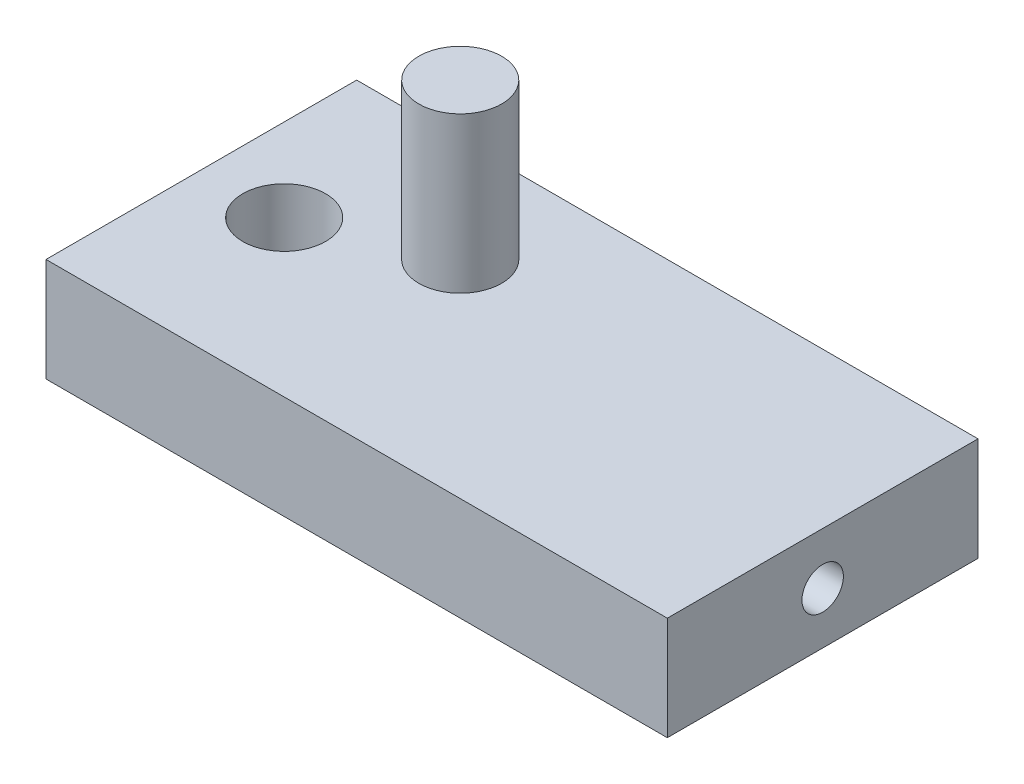
ISO-10303-21;
HEADER;
FILE_DESCRIPTION(('STEP AP214'),'2;1');
FILE_NAME('part.step','',(''),(''),'','','');
FILE_SCHEMA(('AUTOMOTIVE_DESIGN { 1 0 10303 214 1 1 1 1 }'));
ENDSEC;
DATA;
#1=APPLICATION_CONTEXT('core data for automotive mechanical design processes');
#2=APPLICATION_PROTOCOL_DEFINITION('international standard','automotive_design',2000,#1);
#3=PRODUCT_CONTEXT('',#1,'mechanical');
#4=PRODUCT('Part','Part','',(#3));
#5=PRODUCT_RELATED_PRODUCT_CATEGORY('part','',(#4));
#6=PRODUCT_DEFINITION_FORMATION('','',#4);
#7=PRODUCT_DEFINITION_CONTEXT('part definition',#1,'design');
#8=PRODUCT_DEFINITION('design','',#6,#7);
#9=PRODUCT_DEFINITION_SHAPE('','',#8);
#10=(LENGTH_UNIT() NAMED_UNIT(*) SI_UNIT(.MILLI.,.METRE.));
#11=(NAMED_UNIT(*) PLANE_ANGLE_UNIT() SI_UNIT($,.RADIAN.));
#12=(NAMED_UNIT(*) SI_UNIT($,.STERADIAN.) SOLID_ANGLE_UNIT());
#13=UNCERTAINTY_MEASURE_WITH_UNIT(LENGTH_MEASURE(1.E-05),#10,'distance_accuracy_value','');
#14=(GEOMETRIC_REPRESENTATION_CONTEXT(3) GLOBAL_UNCERTAINTY_ASSIGNED_CONTEXT((#13)) GLOBAL_UNIT_ASSIGNED_CONTEXT((#10,
#11,#12)) REPRESENTATION_CONTEXT('',''));
#15=CARTESIAN_POINT('',(0.,0.,0.));
#16=DIRECTION('',(0.,0.,1.));
#17=DIRECTION('',(1.,0.,0.));
#18=AXIS2_PLACEMENT_3D('',#15,#16,#17);
#19=CARTESIAN_POINT('',(15.,2.5,0.));
#20=DIRECTION('',(1.,0.,0.));
#21=DIRECTION('',(0.,0.,-1.));
#22=AXIS2_PLACEMENT_3D('',#19,#20,#21);
#23=PLANE('',#22);
#24=CARTESIAN_POINT('',(15.,0.,0.));
#25=DIRECTION('',(1.,0.,0.));
#26=DIRECTION('',(0.,0.,-1.));
#27=AXIS2_PLACEMENT_3D('',#24,#25,#26);
#28=CIRCLE('',#27,1.);
#29=CARTESIAN_POINT('',(15.,0.,-1.));
#30=VERTEX_POINT('',#29);
#31=EDGE_CURVE('E156',#30,#30,#28,.T.);
#32=ORIENTED_EDGE('',*,*,#31,.F.);
#33=EDGE_LOOP('',(#32));
#34=FACE_BOUND('',#33,.T.);
#35=DIRECTION('',(0.,0.,1.));
#36=VECTOR('',#35,1.);
#37=CARTESIAN_POINT('',(15.,-2.5,0.));
#38=LINE('',#37,#36);
#39=CARTESIAN_POINT('',(15.,-2.5,-7.5));
#40=VERTEX_POINT('',#39);
#41=CARTESIAN_POINT('',(15.,-2.5,7.5));
#42=VERTEX_POINT('',#41);
#43=EDGE_CURVE('E106',#40,#42,#38,.T.);
#44=ORIENTED_EDGE('',*,*,#43,.F.);
#45=DIRECTION('',(0.,-1.,0.));
#46=VECTOR('',#45,1.);
#47=CARTESIAN_POINT('',(15.,2.5,-7.5));
#48=LINE('',#47,#46);
#49=CARTESIAN_POINT('',(15.,2.5,-7.5));
#50=VERTEX_POINT('',#49);
#51=EDGE_CURVE('E11',#50,#40,#48,.T.);
#52=ORIENTED_EDGE('',*,*,#51,.F.);
#53=DIRECTION('',(0.,0.,1.));
#54=VECTOR('',#53,1.);
#55=CARTESIAN_POINT('',(15.,2.5,0.));
#56=LINE('',#55,#54);
#57=CARTESIAN_POINT('',(15.,2.5,7.5));
#58=VERTEX_POINT('',#57);
#59=EDGE_CURVE('E96',#50,#58,#56,.T.);
#60=ORIENTED_EDGE('',*,*,#59,.T.);
#61=DIRECTION('',(0.,-1.,0.));
#62=VECTOR('',#61,1.);
#63=CARTESIAN_POINT('',(15.,2.5,7.5));
#64=LINE('',#63,#62);
#65=EDGE_CURVE('E75',#58,#42,#64,.T.);
#66=ORIENTED_EDGE('',*,*,#65,.T.);
#67=EDGE_LOOP('',(#44,#52,#60,#66));
#68=FACE_BOUND('',#67,.T.);
#69=ADVANCED_FACE('F35',(#34,#68),#23,.T.);
#70=CARTESIAN_POINT('',(0.,2.5,-7.5));
#71=DIRECTION('',(0.,0.,-1.));
#72=DIRECTION('',(-1.,0.,0.));
#73=AXIS2_PLACEMENT_3D('',#70,#71,#72);
#74=PLANE('',#73);
#75=DIRECTION('',(1.,0.,0.));
#76=VECTOR('',#75,1.);
#77=CARTESIAN_POINT('',(0.,-2.5,-7.5));
#78=LINE('',#77,#76);
#79=CARTESIAN_POINT('',(-15.,-2.5,-7.5));
#80=VERTEX_POINT('',#79);
#81=EDGE_CURVE('E87',#80,#40,#78,.T.);
#82=ORIENTED_EDGE('',*,*,#81,.F.);
#83=DIRECTION('',(0.,-1.,0.));
#84=VECTOR('',#83,1.);
#85=CARTESIAN_POINT('',(-15.,2.5,-7.5));
#86=LINE('',#85,#84);
#87=CARTESIAN_POINT('',(-15.,2.5,-7.5));
#88=VERTEX_POINT('',#87);
#89=EDGE_CURVE('E44',#88,#80,#86,.T.);
#90=ORIENTED_EDGE('',*,*,#89,.F.);
#91=DIRECTION('',(1.,0.,0.));
#92=VECTOR('',#91,1.);
#93=CARTESIAN_POINT('',(0.,2.5,-7.5));
#94=LINE('',#93,#92);
#95=EDGE_CURVE('E85',#88,#50,#94,.T.);
#96=ORIENTED_EDGE('',*,*,#95,.T.);
#97=ORIENTED_EDGE('',*,*,#51,.T.);
#98=EDGE_LOOP('',(#82,#90,#96,#97));
#99=FACE_BOUND('',#98,.T.);
#100=ADVANCED_FACE('F83',(#99),#74,.T.);
#101=CARTESIAN_POINT('',(-15.,2.5,0.));
#102=DIRECTION('',(1.,0.,0.));
#103=DIRECTION('',(0.,0.,-1.));
#104=AXIS2_PLACEMENT_3D('',#101,#102,#103);
#105=PLANE('',#104);
#106=DIRECTION('',(0.,0.,1.));
#107=VECTOR('',#106,1.);
#108=CARTESIAN_POINT('',(-15.,-2.5,0.));
#109=LINE('',#108,#107);
#110=CARTESIAN_POINT('',(-15.,-2.5,7.5));
#111=VERTEX_POINT('',#110);
#112=EDGE_CURVE('E110',#80,#111,#109,.T.);
#113=ORIENTED_EDGE('',*,*,#112,.T.);
#114=DIRECTION('',(0.,-1.,0.));
#115=VECTOR('',#114,1.);
#116=CARTESIAN_POINT('',(-15.,2.5,7.5));
#117=LINE('',#116,#115);
#118=CARTESIAN_POINT('',(-15.,2.5,7.5));
#119=VERTEX_POINT('',#118);
#120=EDGE_CURVE('E90',#119,#111,#117,.T.);
#121=ORIENTED_EDGE('',*,*,#120,.F.);
#122=DIRECTION('',(0.,0.,1.));
#123=VECTOR('',#122,1.);
#124=CARTESIAN_POINT('',(-15.,2.5,0.));
#125=LINE('',#124,#123);
#126=EDGE_CURVE('E92',#88,#119,#125,.T.);
#127=ORIENTED_EDGE('',*,*,#126,.F.);
#128=ORIENTED_EDGE('',*,*,#89,.T.);
#129=EDGE_LOOP('',(#113,#121,#127,#128));
#130=FACE_BOUND('',#129,.T.);
#131=ADVANCED_FACE('F93',(#130),#105,.F.);
#132=CARTESIAN_POINT('',(-11.,2.5,0.));
#133=DIRECTION('',(0.,-1.,0.));
#134=DIRECTION('',(0.,0.,-1.));
#135=AXIS2_PLACEMENT_3D('',#132,#133,#134);
#136=CYLINDRICAL_SURFACE('',#135,2.);
#137=CARTESIAN_POINT('',(-11.,2.5,0.));
#138=DIRECTION('',(0.,1.,0.));
#139=DIRECTION('',(0.,0.,1.));
#140=AXIS2_PLACEMENT_3D('',#137,#138,#139);
#141=CIRCLE('',#140,2.);
#142=CARTESIAN_POINT('',(-11.,2.5,2.));
#143=VERTEX_POINT('',#142);
#144=EDGE_CURVE('E98',#143,#143,#141,.T.);
#145=ORIENTED_EDGE('',*,*,#144,.T.);
#146=EDGE_LOOP('',(#145));
#147=FACE_BOUND('',#146,.T.);
#148=CARTESIAN_POINT('',(-11.,-2.5,0.));
#149=DIRECTION('',(0.,1.,0.));
#150=DIRECTION('',(0.,0.,1.));
#151=AXIS2_PLACEMENT_3D('',#148,#149,#150);
#152=CIRCLE('',#151,2.);
#153=CARTESIAN_POINT('',(-11.,-2.5,2.));
#154=VERTEX_POINT('',#153);
#155=EDGE_CURVE('E103',#154,#154,#152,.T.);
#156=ORIENTED_EDGE('',*,*,#155,.F.);
#157=EDGE_LOOP('',(#156));
#158=FACE_BOUND('',#157,.T.);
#159=ADVANCED_FACE('F37',(#147,#158),#136,.F.);
#160=CARTESIAN_POINT('',(0.,2.5,7.5));
#161=DIRECTION('',(0.,0.,-1.));
#162=DIRECTION('',(-1.,0.,0.));
#163=AXIS2_PLACEMENT_3D('',#160,#161,#162);
#164=PLANE('',#163);
#165=DIRECTION('',(1.,0.,0.));
#166=VECTOR('',#165,1.);
#167=CARTESIAN_POINT('',(0.,-2.5,7.5));
#168=LINE('',#167,#166);
#169=EDGE_CURVE('E68',#111,#42,#168,.T.);
#170=ORIENTED_EDGE('',*,*,#169,.T.);
#171=ORIENTED_EDGE('',*,*,#65,.F.);
#172=DIRECTION('',(1.,0.,0.));
#173=VECTOR('',#172,1.);
#174=CARTESIAN_POINT('',(0.,2.5,7.5));
#175=LINE('',#174,#173);
#176=EDGE_CURVE('E52',#119,#58,#175,.T.);
#177=ORIENTED_EDGE('',*,*,#176,.F.);
#178=ORIENTED_EDGE('',*,*,#120,.T.);
#179=EDGE_LOOP('',(#170,#171,#177,#178));
#180=FACE_BOUND('',#179,.T.);
#181=ADVANCED_FACE('F116',(#180),#164,.F.);
#182=CARTESIAN_POINT('',(0.,2.5,0.));
#183=DIRECTION('',(0.,1.,0.));
#184=DIRECTION('',(0.,0.,1.));
#185=AXIS2_PLACEMENT_3D('',#182,#183,#184);
#186=PLANE('',#185);
#187=CARTESIAN_POINT('',(-5.,2.5,-2.5));
#188=DIRECTION('',(0.,1.,0.));
#189=DIRECTION('',(0.,0.,1.));
#190=AXIS2_PLACEMENT_3D('',#187,#188,#189);
#191=CIRCLE('',#190,2.);
#192=CARTESIAN_POINT('',(-5.,2.5,-0.5));
#193=VERTEX_POINT('',#192);
#194=EDGE_CURVE('E113',#193,#193,#191,.T.);
#195=ORIENTED_EDGE('',*,*,#194,.F.);
#196=EDGE_LOOP('',(#195));
#197=FACE_BOUND('',#196,.T.);
#198=ORIENTED_EDGE('',*,*,#144,.F.);
#199=EDGE_LOOP('',(#198));
#200=FACE_BOUND('',#199,.T.);
#201=ORIENTED_EDGE('',*,*,#59,.F.);
#202=ORIENTED_EDGE('',*,*,#95,.F.);
#203=ORIENTED_EDGE('',*,*,#126,.T.);
#204=ORIENTED_EDGE('',*,*,#176,.T.);
#205=EDGE_LOOP('',(#201,#202,#203,#204));
#206=FACE_BOUND('',#205,.T.);
#207=ADVANCED_FACE('F95',(#197,#200,#206),#186,.T.);
#208=CARTESIAN_POINT('',(0.,-2.5,0.));
#209=DIRECTION('',(0.,1.,0.));
#210=DIRECTION('',(0.,0.,1.));
#211=AXIS2_PLACEMENT_3D('',#208,#209,#210);
#212=PLANE('',#211);
#213=ORIENTED_EDGE('',*,*,#155,.T.);
#214=EDGE_LOOP('',(#213));
#215=FACE_BOUND('',#214,.T.);
#216=ORIENTED_EDGE('',*,*,#43,.T.);
#217=ORIENTED_EDGE('',*,*,#169,.F.);
#218=ORIENTED_EDGE('',*,*,#112,.F.);
#219=ORIENTED_EDGE('',*,*,#81,.T.);
#220=EDGE_LOOP('',(#216,#217,#218,#219));
#221=FACE_BOUND('',#220,.T.);
#222=ADVANCED_FACE('F117',(#215,#221),#212,.F.);
#223=CARTESIAN_POINT('',(-5.,-2.5,-2.5));
#224=DIRECTION('',(0.,1.,0.));
#225=DIRECTION('',(0.,0.,1.));
#226=AXIS2_PLACEMENT_3D('',#223,#224,#225);
#227=CYLINDRICAL_SURFACE('',#226,2.);
#228=ORIENTED_EDGE('',*,*,#194,.T.);
#229=EDGE_LOOP('',(#228));
#230=FACE_BOUND('',#229,.T.);
#231=CARTESIAN_POINT('',(-5.,10.,-2.5));
#232=DIRECTION('',(0.,1.,0.));
#233=DIRECTION('',(0.,0.,1.));
#234=AXIS2_PLACEMENT_3D('',#231,#232,#233);
#235=CIRCLE('',#234,2.);
#236=CARTESIAN_POINT('',(-5.,10.,-0.5));
#237=VERTEX_POINT('',#236);
#238=EDGE_CURVE('E107',#237,#237,#235,.T.);
#239=ORIENTED_EDGE('',*,*,#238,.F.);
#240=EDGE_LOOP('',(#239));
#241=FACE_BOUND('',#240,.T.);
#242=ADVANCED_FACE('F132',(#230,#241),#227,.T.);
#243=CARTESIAN_POINT('',(0.,10.,0.));
#244=DIRECTION('',(0.,1.,0.));
#245=DIRECTION('',(0.,0.,1.));
#246=AXIS2_PLACEMENT_3D('',#243,#244,#245);
#247=PLANE('',#246);
#248=ORIENTED_EDGE('',*,*,#238,.T.);
#249=EDGE_LOOP('',(#248));
#250=FACE_BOUND('',#249,.T.);
#251=ADVANCED_FACE('F139',(#250),#247,.T.);
#252=CARTESIAN_POINT('',(5.,0.,0.));
#253=DIRECTION('',(1.,0.,0.));
#254=DIRECTION('',(0.,0.,-1.));
#255=AXIS2_PLACEMENT_3D('',#252,#253,#254);
#256=CYLINDRICAL_SURFACE('',#255,1.);
#257=CARTESIAN_POINT('',(5.,0.,0.));
#258=DIRECTION('',(1.,0.,0.));
#259=DIRECTION('',(0.,0.,-1.));
#260=AXIS2_PLACEMENT_3D('',#257,#258,#259);
#261=CIRCLE('',#260,1.);
#262=CARTESIAN_POINT('',(5.,0.,-1.));
#263=VERTEX_POINT('',#262);
#264=EDGE_CURVE('E155',#263,#263,#261,.T.);
#265=ORIENTED_EDGE('',*,*,#264,.F.);
#266=EDGE_LOOP('',(#265));
#267=FACE_BOUND('',#266,.T.);
#268=ORIENTED_EDGE('',*,*,#31,.T.);
#269=EDGE_LOOP('',(#268));
#270=FACE_BOUND('',#269,.T.);
#271=ADVANCED_FACE('F143',(#267,#270),#256,.F.);
#272=CARTESIAN_POINT('',(5.,0.,0.));
#273=DIRECTION('',(1.,0.,0.));
#274=DIRECTION('',(0.,0.,-1.));
#275=AXIS2_PLACEMENT_3D('',#272,#273,#274);
#276=PLANE('',#275);
#277=ORIENTED_EDGE('',*,*,#264,.T.);
#278=EDGE_LOOP('',(#277));
#279=FACE_BOUND('',#278,.T.);
#280=ADVANCED_FACE('F147',(#279),#276,.T.);
#281=CLOSED_SHELL('',(#69,#100,#131,#159,#181,#207,#222,#242,#251,#271,#280));
#282=MANIFOLD_SOLID_BREP('B2',#281);
#283=ADVANCED_BREP_SHAPE_REPRESENTATION('',(#18,#282),#14);
#284=SHAPE_DEFINITION_REPRESENTATION(#9,#283);
ENDSEC;
END-ISO-10303-21;
